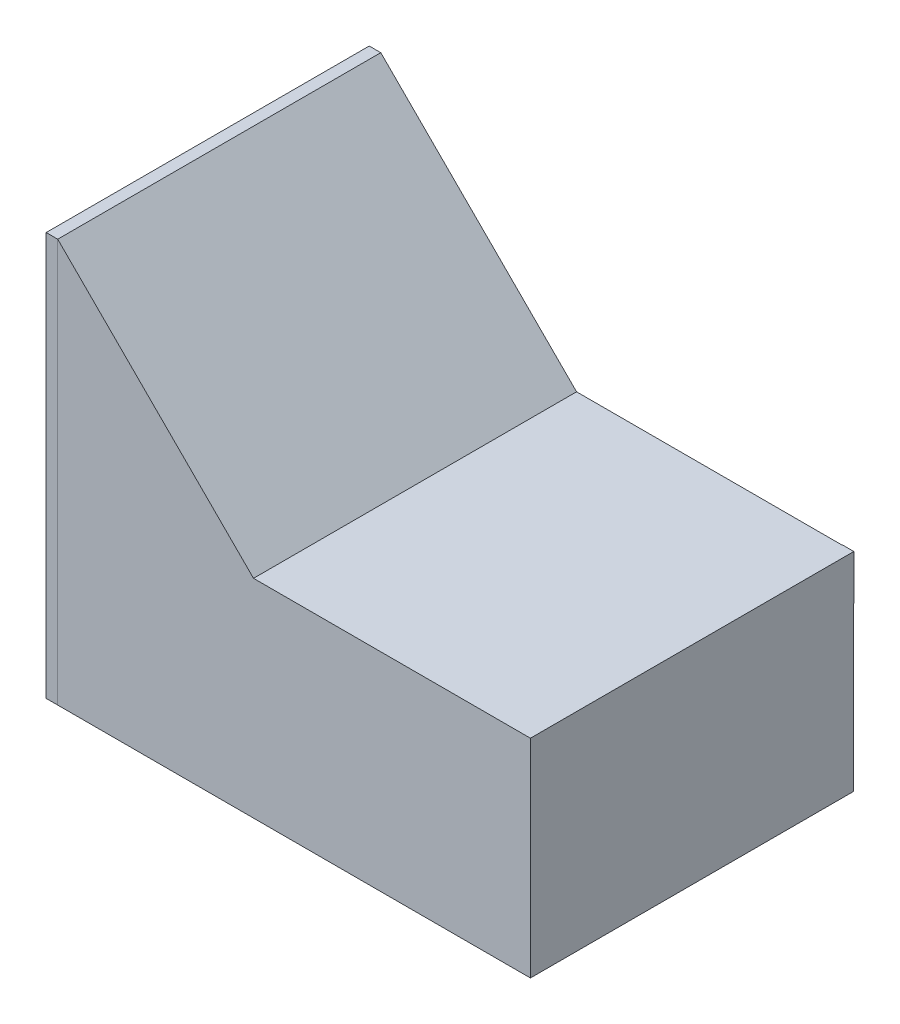
ISO-10303-21;
HEADER;
FILE_DESCRIPTION(('STEP AP214'),'2;1');
FILE_NAME('part.step','',(''),(''),'','','');
FILE_SCHEMA(('AUTOMOTIVE_DESIGN { 1 0 10303 214 1 1 1 1 }'));
ENDSEC;
DATA;
#1=APPLICATION_CONTEXT('core data for automotive mechanical design processes');
#2=APPLICATION_PROTOCOL_DEFINITION('international standard','automotive_design',2000,#1);
#3=PRODUCT_CONTEXT('',#1,'mechanical');
#4=PRODUCT('Part','Part','',(#3));
#5=PRODUCT_RELATED_PRODUCT_CATEGORY('part','',(#4));
#6=PRODUCT_DEFINITION_FORMATION('','',#4);
#7=PRODUCT_DEFINITION_CONTEXT('part definition',#1,'design');
#8=PRODUCT_DEFINITION('design','',#6,#7);
#9=PRODUCT_DEFINITION_SHAPE('','',#8);
#10=(LENGTH_UNIT() NAMED_UNIT(*) SI_UNIT(.MILLI.,.METRE.));
#11=(NAMED_UNIT(*) PLANE_ANGLE_UNIT() SI_UNIT($,.RADIAN.));
#12=(NAMED_UNIT(*) SI_UNIT($,.STERADIAN.) SOLID_ANGLE_UNIT());
#13=UNCERTAINTY_MEASURE_WITH_UNIT(LENGTH_MEASURE(1.E-05),#10,'distance_accuracy_value','');
#14=(GEOMETRIC_REPRESENTATION_CONTEXT(3) GLOBAL_UNCERTAINTY_ASSIGNED_CONTEXT((#13)) GLOBAL_UNIT_ASSIGNED_CONTEXT((#10,
#11,#12)) REPRESENTATION_CONTEXT('',''));
#15=CARTESIAN_POINT('',(0.,0.,0.));
#16=DIRECTION('',(0.,0.,1.));
#17=DIRECTION('',(1.,0.,0.));
#18=AXIS2_PLACEMENT_3D('',#15,#16,#17);
#19=CARTESIAN_POINT('',(-209.852813742386,174.852813742386,0.));
#20=DIRECTION('',(0.,0.,-1.));
#21=DIRECTION('',(-1.,0.,0.));
#22=AXIS2_PLACEMENT_3D('',#19,#20,#21);
#23=PLANE('',#22);
#24=DIRECTION('',(0.,1.,0.));
#25=VECTOR('',#24,1.);
#26=CARTESIAN_POINT('',(-204.852813742386,174.852813742386,0.));
#27=LINE('',#26,#25);
#28=CARTESIAN_POINT('',(-204.852813742386,0.,0.));
#29=VERTEX_POINT('',#28);
#30=CARTESIAN_POINT('',(-204.852813742386,174.852813742386,0.));
#31=VERTEX_POINT('',#30);
#32=EDGE_CURVE('E114',#29,#31,#27,.T.);
#33=ORIENTED_EDGE('',*,*,#32,.T.);
#34=DIRECTION('',(1.,0.,0.));
#35=VECTOR('',#34,1.);
#36=CARTESIAN_POINT('',(-209.852813742386,174.852813742386,0.));
#37=LINE('',#36,#35);
#38=CARTESIAN_POINT('',(-209.852813742386,174.852813742386,0.));
#39=VERTEX_POINT('',#38);
#40=EDGE_CURVE('E12',#39,#31,#37,.T.);
#41=ORIENTED_EDGE('',*,*,#40,.F.);
#42=DIRECTION('',(0.,1.,0.));
#43=VECTOR('',#42,1.);
#44=CARTESIAN_POINT('',(-209.852813742386,174.852813742386,0.));
#45=LINE('',#44,#43);
#46=CARTESIAN_POINT('',(-209.852813742386,0.,0.));
#47=VERTEX_POINT('',#46);
#48=EDGE_CURVE('E102',#47,#39,#45,.T.);
#49=ORIENTED_EDGE('',*,*,#48,.F.);
#50=DIRECTION('',(1.,0.,0.));
#51=VECTOR('',#50,1.);
#52=CARTESIAN_POINT('',(-209.852813742386,0.,0.));
#53=LINE('',#52,#51);
#54=EDGE_CURVE('E110',#47,#29,#53,.T.);
#55=ORIENTED_EDGE('',*,*,#54,.T.);
#56=EDGE_LOOP('',(#33,#41,#49,#55));
#57=FACE_BOUND('',#56,.T.);
#58=ADVANCED_FACE('F51',(#57),#23,.F.);
#59=CARTESIAN_POINT('',(-209.852813742386,174.852813742386,0.));
#60=DIRECTION('',(0.,-1.,0.));
#61=DIRECTION('',(0.,0.,-1.));
#62=AXIS2_PLACEMENT_3D('',#59,#60,#61);
#63=PLANE('',#62);
#64=DIRECTION('',(0.,0.,-1.));
#65=VECTOR('',#64,1.);
#66=CARTESIAN_POINT('',(-204.852813742386,174.852813742386,0.));
#67=LINE('',#66,#65);
#68=CARTESIAN_POINT('',(-204.852813742386,174.852813742386,-140.));
#69=VERTEX_POINT('',#68);
#70=EDGE_CURVE('E106',#31,#69,#67,.T.);
#71=ORIENTED_EDGE('',*,*,#70,.T.);
#72=DIRECTION('',(1.,0.,0.));
#73=VECTOR('',#72,1.);
#74=CARTESIAN_POINT('',(-209.852813742386,174.852813742386,-140.));
#75=LINE('',#74,#73);
#76=CARTESIAN_POINT('',(-209.852813742386,174.852813742386,-140.));
#77=VERTEX_POINT('',#76);
#78=EDGE_CURVE('E59',#77,#69,#75,.T.);
#79=ORIENTED_EDGE('',*,*,#78,.F.);
#80=DIRECTION('',(0.,0.,-1.));
#81=VECTOR('',#80,1.);
#82=CARTESIAN_POINT('',(-209.852813742386,174.852813742386,0.));
#83=LINE('',#82,#81);
#84=EDGE_CURVE('E97',#39,#77,#83,.T.);
#85=ORIENTED_EDGE('',*,*,#84,.F.);
#86=ORIENTED_EDGE('',*,*,#40,.T.);
#87=EDGE_LOOP('',(#71,#79,#85,#86));
#88=FACE_BOUND('',#87,.T.);
#89=ADVANCED_FACE('F105',(#88),#63,.F.);
#90=CARTESIAN_POINT('',(-209.852813742386,174.852813742386,-140.));
#91=DIRECTION('',(0.,0.,1.));
#92=DIRECTION('',(1.,0.,0.));
#93=AXIS2_PLACEMENT_3D('',#90,#91,#92);
#94=PLANE('',#93);
#95=DIRECTION('',(0.,-1.,0.));
#96=VECTOR('',#95,1.);
#97=CARTESIAN_POINT('',(-204.852813742386,174.852813742386,-140.));
#98=LINE('',#97,#96);
#99=CARTESIAN_POINT('',(-204.852813742386,0.,-140.));
#100=VERTEX_POINT('',#99);
#101=EDGE_CURVE('E84',#69,#100,#98,.T.);
#102=ORIENTED_EDGE('',*,*,#101,.T.);
#103=DIRECTION('',(1.,0.,0.));
#104=VECTOR('',#103,1.);
#105=CARTESIAN_POINT('',(-209.852813742386,0.,-140.));
#106=LINE('',#105,#104);
#107=CARTESIAN_POINT('',(-209.852813742386,0.,-140.));
#108=VERTEX_POINT('',#107);
#109=EDGE_CURVE('E107',#108,#100,#106,.T.);
#110=ORIENTED_EDGE('',*,*,#109,.F.);
#111=DIRECTION('',(0.,-1.,0.));
#112=VECTOR('',#111,1.);
#113=CARTESIAN_POINT('',(-209.852813742386,174.852813742386,-140.));
#114=LINE('',#113,#112);
#115=EDGE_CURVE('E100',#77,#108,#114,.T.);
#116=ORIENTED_EDGE('',*,*,#115,.F.);
#117=ORIENTED_EDGE('',*,*,#78,.T.);
#118=EDGE_LOOP('',(#102,#110,#116,#117));
#119=FACE_BOUND('',#118,.T.);
#120=ADVANCED_FACE('F108',(#119),#94,.F.);
#121=CARTESIAN_POINT('',(-209.852813742386,0.,-140.));
#122=DIRECTION('',(0.,1.,0.));
#123=DIRECTION('',(0.,0.,1.));
#124=AXIS2_PLACEMENT_3D('',#121,#122,#123);
#125=PLANE('',#124);
#126=DIRECTION('',(0.,0.,1.));
#127=VECTOR('',#126,1.);
#128=CARTESIAN_POINT('',(-204.852813742386,0.,-140.));
#129=LINE('',#128,#127);
#130=EDGE_CURVE('E90',#100,#29,#129,.T.);
#131=ORIENTED_EDGE('',*,*,#130,.T.);
#132=ORIENTED_EDGE('',*,*,#54,.F.);
#133=DIRECTION('',(0.,0.,1.));
#134=VECTOR('',#133,1.);
#135=CARTESIAN_POINT('',(-209.852813742386,0.,-140.));
#136=LINE('',#135,#134);
#137=EDGE_CURVE('E67',#108,#47,#136,.T.);
#138=ORIENTED_EDGE('',*,*,#137,.F.);
#139=ORIENTED_EDGE('',*,*,#109,.T.);
#140=EDGE_LOOP('',(#131,#132,#138,#139));
#141=FACE_BOUND('',#140,.T.);
#142=ADVANCED_FACE('F121',(#141),#125,.F.);
#143=CARTESIAN_POINT('',(-209.852813742386,0.,0.));
#144=DIRECTION('',(-1.,0.,0.));
#145=DIRECTION('',(0.,0.,1.));
#146=AXIS2_PLACEMENT_3D('',#143,#144,#145);
#147=PLANE('',#146);
#148=ORIENTED_EDGE('',*,*,#48,.T.);
#149=ORIENTED_EDGE('',*,*,#84,.T.);
#150=ORIENTED_EDGE('',*,*,#115,.T.);
#151=ORIENTED_EDGE('',*,*,#137,.T.);
#152=EDGE_LOOP('',(#148,#149,#150,#151));
#153=FACE_BOUND('',#152,.T.);
#154=ADVANCED_FACE('F98',(#153),#147,.T.);
#155=CARTESIAN_POINT('',(-204.852813742386,0.,0.));
#156=DIRECTION('',(-1.,0.,0.));
#157=DIRECTION('',(0.,0.,1.));
#158=AXIS2_PLACEMENT_3D('',#155,#156,#157);
#159=PLANE('',#158);
#160=ORIENTED_EDGE('',*,*,#32,.F.);
#161=ORIENTED_EDGE('',*,*,#130,.F.);
#162=ORIENTED_EDGE('',*,*,#101,.F.);
#163=ORIENTED_EDGE('',*,*,#70,.F.);
#164=EDGE_LOOP('',(#160,#161,#162,#163));
#165=FACE_BOUND('',#164,.T.);
#166=ADVANCED_FACE('F124',(#165),#159,.F.);
#167=CLOSED_SHELL('',(#58,#89,#120,#142,#154,#166));
#168=MANIFOLD_SOLID_BREP('B2',#167);
#169=CARTESIAN_POINT('',(-18.5355339059329,-18.5355339059329,0.));
#170=DIRECTION('',(0.707106781186548,0.707106781186547,0.));
#171=DIRECTION('',(-0.707106781186547,0.707106781186548,0.));
#172=AXIS2_PLACEMENT_3D('',#169,#170,#171);
#173=PLANE('',#172);
#174=DIRECTION('',(0.,0.,-1.));
#175=VECTOR('',#174,1.);
#176=CARTESIAN_POINT('',(-204.852813742386,167.78174593052,0.));
#177=LINE('',#176,#175);
#178=CARTESIAN_POINT('',(-204.852813742386,167.78174593052,-135.));
#179=VERTEX_POINT('',#178);
#180=CARTESIAN_POINT('',(-204.852813742386,167.78174593052,-140.));
#181=VERTEX_POINT('',#180);
#182=EDGE_CURVE('E49',#179,#181,#177,.T.);
#183=ORIENTED_EDGE('',*,*,#182,.F.);
#184=DIRECTION('',(0.707106781186547,-0.707106781186548,0.));
#185=VECTOR('',#184,1.);
#186=CARTESIAN_POINT('',(-18.5355339059329,-18.5355339059328,-135.));
#187=LINE('',#186,#185);
#188=CARTESIAN_POINT('',(-125.,87.9289321881345,-135.));
#189=VERTEX_POINT('',#188);
#190=EDGE_CURVE('E419',#179,#189,#187,.T.);
#191=ORIENTED_EDGE('',*,*,#190,.T.);
#192=DIRECTION('',(0.,0.,-1.));
#193=VECTOR('',#192,1.);
#194=CARTESIAN_POINT('',(-125.,87.9289321881345,0.));
#195=LINE('',#194,#193);
#196=CARTESIAN_POINT('',(-125.,87.9289321881345,-5.));
#197=VERTEX_POINT('',#196);
#198=EDGE_CURVE('E261',#197,#189,#195,.T.);
#199=ORIENTED_EDGE('',*,*,#198,.F.);
#200=DIRECTION('',(-0.707106781186547,0.707106781186548,0.));
#201=VECTOR('',#200,1.);
#202=CARTESIAN_POINT('',(-18.5355339059329,-18.5355339059329,-5.00000000000001));
#203=LINE('',#202,#201);
#204=CARTESIAN_POINT('',(-204.852813742386,167.78174593052,-5.));
#205=VERTEX_POINT('',#204);
#206=EDGE_CURVE('E323',#197,#205,#203,.T.);
#207=ORIENTED_EDGE('',*,*,#206,.T.);
#208=CARTESIAN_POINT('',(-208.388347648318,171.317279836453,-5.));
#209=VERTEX_POINT('',#208);
#210=EDGE_CURVE('E320',#205,#209,#203,.T.);
#211=ORIENTED_EDGE('',*,*,#210,.T.);
#212=DIRECTION('',(0.,0.,-1.));
#213=VECTOR('',#212,1.);
#214=CARTESIAN_POINT('',(-208.388347648318,171.317279836453,0.));
#215=LINE('',#214,#213);
#216=CARTESIAN_POINT('',(-208.388347648318,171.317279836453,-140.));
#217=VERTEX_POINT('',#216);
#218=EDGE_CURVE('E327',#209,#217,#215,.T.);
#219=ORIENTED_EDGE('',*,*,#218,.T.);
#220=DIRECTION('',(0.707106781186547,-0.707106781186548,0.));
#221=VECTOR('',#220,1.);
#222=CARTESIAN_POINT('',(-18.5355339059329,-18.5355339059328,-140.));
#223=LINE('',#222,#221);
#224=EDGE_CURVE('E324',#217,#181,#223,.T.);
#225=ORIENTED_EDGE('',*,*,#224,.T.);
#226=EDGE_LOOP('',(#183,#191,#199,#207,#211,#219,#225));
#227=FACE_BOUND('',#226,.T.);
#228=ADVANCED_FACE('F187',(#227),#173,.F.);
#229=CARTESIAN_POINT('',(-5.,0.,0.));
#230=DIRECTION('',(-1.,0.,0.));
#231=DIRECTION('',(0.,-1.,0.));
#232=AXIS2_PLACEMENT_3D('',#229,#230,#231);
#233=PLANE('',#232);
#234=DIRECTION('',(0.,0.999998636393386,-0.00165142707042378));
#235=VECTOR('',#234,1.);
#236=CARTESIAN_POINT('',(-5.,90.,-140.148628639009));
#237=LINE('',#236,#235);
#238=CARTESIAN_POINT('',(-5.,0.,-140.));
#239=VERTEX_POINT('',#238);
#240=CARTESIAN_POINT('',(-5.,90.,-140.148628639009));
#241=VERTEX_POINT('',#240);
#242=EDGE_CURVE('E436',#239,#241,#237,.T.);
#243=ORIENTED_EDGE('',*,*,#242,.F.);
#244=DIRECTION('',(0.,1.,0.));
#245=VECTOR('',#244,1.);
#246=CARTESIAN_POINT('',(-5.,85.,-140.));
#247=LINE('',#246,#245);
#248=CARTESIAN_POINT('',(-5.,90.,-140.));
#249=VERTEX_POINT('',#248);
#250=EDGE_CURVE('E310',#239,#249,#247,.T.);
#251=ORIENTED_EDGE('',*,*,#250,.T.);
#252=DIRECTION('',(0.,0.,1.));
#253=VECTOR('',#252,1.);
#254=CARTESIAN_POINT('',(-5.,90.,0.));
#255=LINE('',#254,#253);
#256=EDGE_CURVE('E384',#241,#249,#255,.T.);
#257=ORIENTED_EDGE('',*,*,#256,.F.);
#258=EDGE_LOOP('',(#243,#251,#257));
#259=FACE_BOUND('',#258,.T.);
#260=ADVANCED_FACE('F449',(#259),#233,.T.);
#261=CARTESIAN_POINT('',(0.,0.,-5.));
#262=DIRECTION('',(0.,0.,-1.));
#263=DIRECTION('',(-1.,0.,0.));
#264=AXIS2_PLACEMENT_3D('',#261,#262,#263);
#265=PLANE('',#264);
#266=DIRECTION('',(0.,1.,0.));
#267=VECTOR('',#266,1.);
#268=CARTESIAN_POINT('',(-5.,0.,-5.));
#269=LINE('',#268,#267);
#270=CARTESIAN_POINT('',(-5.,0.,-5.));
#271=VERTEX_POINT('',#270);
#272=CARTESIAN_POINT('',(-5.,85.,-5.));
#273=VERTEX_POINT('',#272);
#274=EDGE_CURVE('E303',#271,#273,#269,.T.);
#275=ORIENTED_EDGE('',*,*,#274,.F.);
#276=DIRECTION('',(1.,0.,0.));
#277=VECTOR('',#276,1.);
#278=CARTESIAN_POINT('',(0.,0.,-5.));
#279=LINE('',#278,#277);
#280=CARTESIAN_POINT('',(-204.852813742386,0.,-5.));
#281=VERTEX_POINT('',#280);
#282=EDGE_CURVE('E268',#281,#271,#279,.T.);
#283=ORIENTED_EDGE('',*,*,#282,.F.);
#284=DIRECTION('',(0.,-1.,0.));
#285=VECTOR('',#284,1.);
#286=CARTESIAN_POINT('',(-204.852813742386,0.,-5.));
#287=LINE('',#286,#285);
#288=EDGE_CURVE('E211',#205,#281,#287,.T.);
#289=ORIENTED_EDGE('',*,*,#288,.F.);
#290=ORIENTED_EDGE('',*,*,#206,.F.);
#291=DIRECTION('',(0.,1.,0.));
#292=VECTOR('',#291,1.);
#293=CARTESIAN_POINT('',(-125.,85.,-5.));
#294=LINE('',#293,#292);
#295=CARTESIAN_POINT('',(-125.,85.,-5.));
#296=VERTEX_POINT('',#295);
#297=EDGE_CURVE('E339',#296,#197,#294,.T.);
#298=ORIENTED_EDGE('',*,*,#297,.F.);
#299=DIRECTION('',(-1.,0.,0.));
#300=VECTOR('',#299,1.);
#301=CARTESIAN_POINT('',(0.,85.,-5.));
#302=LINE('',#301,#300);
#303=EDGE_CURVE('E344',#273,#296,#302,.T.);
#304=ORIENTED_EDGE('',*,*,#303,.F.);
#305=EDGE_LOOP('',(#275,#283,#289,#290,#298,#304));
#306=FACE_BOUND('',#305,.T.);
#307=ADVANCED_FACE('F451',(#306),#265,.T.);
#308=CARTESIAN_POINT('',(-125.,0.,0.));
#309=DIRECTION('',(-1.,0.,0.));
#310=DIRECTION('',(0.,0.,1.));
#311=AXIS2_PLACEMENT_3D('',#308,#309,#310);
#312=PLANE('',#311);
#313=DIRECTION('',(0.,1.,0.));
#314=VECTOR('',#313,1.);
#315=CARTESIAN_POINT('',(-125.,0.,-135.));
#316=LINE('',#315,#314);
#317=CARTESIAN_POINT('',(-125.,85.,-135.));
#318=VERTEX_POINT('',#317);
#319=EDGE_CURVE('E297',#318,#189,#316,.T.);
#320=ORIENTED_EDGE('',*,*,#319,.F.);
#321=DIRECTION('',(0.,0.,1.));
#322=VECTOR('',#321,1.);
#323=CARTESIAN_POINT('',(-125.,85.,-140.));
#324=LINE('',#323,#322);
#325=EDGE_CURVE('E202',#318,#296,#324,.T.);
#326=ORIENTED_EDGE('',*,*,#325,.T.);
#327=ORIENTED_EDGE('',*,*,#297,.T.);
#328=ORIENTED_EDGE('',*,*,#198,.T.);
#329=EDGE_LOOP('',(#320,#326,#327,#328));
#330=FACE_BOUND('',#329,.T.);
#331=ADVANCED_FACE('F457',(#330),#312,.T.);
#332=CARTESIAN_POINT('',(0.,90.,-5.));
#333=DIRECTION('',(1.,0.,0.));
#334=DIRECTION('',(0.,1.,0.));
#335=AXIS2_PLACEMENT_3D('',#332,#333,#334);
#336=PLANE('',#335);
#337=DIRECTION('',(0.,1.,0.));
#338=VECTOR('',#337,1.);
#339=CARTESIAN_POINT('',(0.,90.,0.));
#340=LINE('',#339,#338);
#341=CARTESIAN_POINT('',(0.,0.,0.));
#342=VERTEX_POINT('',#341);
#343=CARTESIAN_POINT('',(0.,90.,0.));
#344=VERTEX_POINT('',#343);
#345=EDGE_CURVE('E345',#342,#344,#340,.T.);
#346=ORIENTED_EDGE('',*,*,#345,.F.);
#347=DIRECTION('',(0.,0.,1.));
#348=VECTOR('',#347,1.);
#349=CARTESIAN_POINT('',(0.,0.,-5.));
#350=LINE('',#349,#348);
#351=CARTESIAN_POINT('',(0.,0.,-140.));
#352=VERTEX_POINT('',#351);
#353=EDGE_CURVE('E239',#352,#342,#350,.T.);
#354=ORIENTED_EDGE('',*,*,#353,.F.);
#355=DIRECTION('',(0.,0.999998636393386,-0.00165142707042378));
#356=VECTOR('',#355,1.);
#357=CARTESIAN_POINT('',(0.,90.,-140.148628639009));
#358=LINE('',#357,#356);
#359=CARTESIAN_POINT('',(0.,90.,-140.148628639009));
#360=VERTEX_POINT('',#359);
#361=EDGE_CURVE('E434',#352,#360,#358,.T.);
#362=ORIENTED_EDGE('',*,*,#361,.T.);
#363=DIRECTION('',(0.,0.,1.));
#364=VECTOR('',#363,1.);
#365=CARTESIAN_POINT('',(0.,90.,-5.));
#366=LINE('',#365,#364);
#367=EDGE_CURVE('E266',#360,#344,#366,.T.);
#368=ORIENTED_EDGE('',*,*,#367,.T.);
#369=EDGE_LOOP('',(#346,#354,#362,#368));
#370=FACE_BOUND('',#369,.T.);
#371=ADVANCED_FACE('F189',(#370),#336,.T.);
#372=CARTESIAN_POINT('',(0.,0.,-5.));
#373=DIRECTION('',(0.,-1.,0.));
#374=DIRECTION('',(1.,0.,0.));
#375=AXIS2_PLACEMENT_3D('',#372,#373,#374);
#376=PLANE('',#375);
#377=DIRECTION('',(0.,0.,-1.));
#378=VECTOR('',#377,1.);
#379=CARTESIAN_POINT('',(-5.,0.,-140.));
#380=LINE('',#379,#378);
#381=CARTESIAN_POINT('',(-5.,0.,-135.));
#382=VERTEX_POINT('',#381);
#383=EDGE_CURVE('E305',#271,#382,#380,.T.);
#384=ORIENTED_EDGE('',*,*,#383,.T.);
#385=DIRECTION('',(1.,0.,0.));
#386=VECTOR('',#385,1.);
#387=CARTESIAN_POINT('',(0.,0.,-135.));
#388=LINE('',#387,#386);
#389=CARTESIAN_POINT('',(-204.852813742386,0.,-135.));
#390=VERTEX_POINT('',#389);
#391=EDGE_CURVE('E288',#390,#382,#388,.T.);
#392=ORIENTED_EDGE('',*,*,#391,.F.);
#393=DIRECTION('',(0.,0.,-1.));
#394=VECTOR('',#393,1.);
#395=CARTESIAN_POINT('',(-204.852813742386,0.,-135.));
#396=LINE('',#395,#394);
#397=CARTESIAN_POINT('',(-204.852813742386,0.,-140.));
#398=VERTEX_POINT('',#397);
#399=EDGE_CURVE('E298',#390,#398,#396,.T.);
#400=ORIENTED_EDGE('',*,*,#399,.T.);
#401=DIRECTION('',(1.,0.,0.));
#402=VECTOR('',#401,1.);
#403=CARTESIAN_POINT('',(0.,0.,-140.));
#404=LINE('',#403,#402);
#405=EDGE_CURVE('E428',#398,#239,#404,.T.);
#406=ORIENTED_EDGE('',*,*,#405,.T.);
#407=DIRECTION('',(1.,0.,0.));
#408=VECTOR('',#407,1.);
#409=CARTESIAN_POINT('',(-5.,0.,-140.));
#410=LINE('',#409,#408);
#411=EDGE_CURVE('E440',#239,#352,#410,.T.);
#412=ORIENTED_EDGE('',*,*,#411,.T.);
#413=ORIENTED_EDGE('',*,*,#353,.T.);
#414=DIRECTION('',(1.,0.,0.));
#415=VECTOR('',#414,1.);
#416=CARTESIAN_POINT('',(0.,0.,0.));
#417=LINE('',#416,#415);
#418=CARTESIAN_POINT('',(-204.852813742386,0.,0.));
#419=VERTEX_POINT('',#418);
#420=EDGE_CURVE('E246',#419,#342,#417,.T.);
#421=ORIENTED_EDGE('',*,*,#420,.F.);
#422=DIRECTION('',(0.,0.,1.));
#423=VECTOR('',#422,1.);
#424=CARTESIAN_POINT('',(-204.852813742386,0.,-5.));
#425=LINE('',#424,#423);
#426=EDGE_CURVE('E229',#281,#419,#425,.T.);
#427=ORIENTED_EDGE('',*,*,#426,.F.);
#428=ORIENTED_EDGE('',*,*,#282,.T.);
#429=EDGE_LOOP('',(#384,#392,#400,#406,#412,#413,#421,#427,#428));
#430=FACE_BOUND('',#429,.T.);
#431=ADVANCED_FACE('F253',(#430),#376,.T.);
#432=CARTESIAN_POINT('',(-204.852813742386,0.,-5.));
#433=DIRECTION('',(-1.,0.,0.));
#434=DIRECTION('',(0.,-1.,0.));
#435=AXIS2_PLACEMENT_3D('',#432,#433,#434);
#436=PLANE('',#435);
#437=DIRECTION('',(0.,-1.,0.));
#438=VECTOR('',#437,1.);
#439=CARTESIAN_POINT('',(-204.852813742386,0.,0.));
#440=LINE('',#439,#438);
#441=CARTESIAN_POINT('',(-204.852813742386,174.852813742386,0.));
#442=VERTEX_POINT('',#441);
#443=EDGE_CURVE('E233',#442,#419,#440,.T.);
#444=ORIENTED_EDGE('',*,*,#443,.F.);
#445=DIRECTION('',(0.,0.,1.));
#446=VECTOR('',#445,1.);
#447=CARTESIAN_POINT('',(-204.852813742386,174.852813742386,-5.));
#448=LINE('',#447,#446);
#449=CARTESIAN_POINT('',(-204.852813742386,174.852813742386,-5.));
#450=VERTEX_POINT('',#449);
#451=EDGE_CURVE('E240',#450,#442,#448,.T.);
#452=ORIENTED_EDGE('',*,*,#451,.F.);
#453=EDGE_CURVE('E257',#450,#205,#287,.T.);
#454=ORIENTED_EDGE('',*,*,#453,.T.);
#455=ORIENTED_EDGE('',*,*,#288,.T.);
#456=ORIENTED_EDGE('',*,*,#426,.T.);
#457=EDGE_LOOP('',(#444,#452,#454,#455,#456));
#458=FACE_BOUND('',#457,.T.);
#459=ADVANCED_FACE('F231',(#458),#436,.T.);
#460=CARTESIAN_POINT('',(-204.852813742386,174.852813742386,-5.));
#461=DIRECTION('',(0.707106781186548,0.707106781186547,0.));
#462=DIRECTION('',(-0.707106781186547,0.707106781186548,0.));
#463=AXIS2_PLACEMENT_3D('',#460,#461,#462);
#464=PLANE('',#463);
#465=DIRECTION('',(-0.707106781186547,0.707106781186548,0.));
#466=VECTOR('',#465,1.);
#467=CARTESIAN_POINT('',(-204.852813742386,174.852813742386,0.));
#468=LINE('',#467,#466);
#469=CARTESIAN_POINT('',(-120.,90.,0.));
#470=VERTEX_POINT('',#469);
#471=EDGE_CURVE('E250',#470,#442,#468,.T.);
#472=ORIENTED_EDGE('',*,*,#471,.F.);
#473=DIRECTION('',(0.,0.,1.));
#474=VECTOR('',#473,1.);
#475=CARTESIAN_POINT('',(-120.,90.,-5.));
#476=LINE('',#475,#474);
#477=CARTESIAN_POINT('',(-120.,90.,-140.));
#478=VERTEX_POINT('',#477);
#479=EDGE_CURVE('E264',#478,#470,#476,.T.);
#480=ORIENTED_EDGE('',*,*,#479,.F.);
#481=DIRECTION('',(0.707106781186547,-0.707106781186548,0.));
#482=VECTOR('',#481,1.);
#483=CARTESIAN_POINT('',(-15.0000000000002,-15.0000000000001,-140.));
#484=LINE('',#483,#482);
#485=CARTESIAN_POINT('',(-204.852813742386,174.852813742386,-140.));
#486=VERTEX_POINT('',#485);
#487=EDGE_CURVE('E309',#486,#478,#484,.T.);
#488=ORIENTED_EDGE('',*,*,#487,.F.);
#489=DIRECTION('',(0.,0.,-1.));
#490=VECTOR('',#489,1.);
#491=CARTESIAN_POINT('',(-204.852813742386,174.852813742386,0.));
#492=LINE('',#491,#490);
#493=EDGE_CURVE('E313',#450,#486,#492,.T.);
#494=ORIENTED_EDGE('',*,*,#493,.F.);
#495=ORIENTED_EDGE('',*,*,#451,.T.);
#496=EDGE_LOOP('',(#472,#480,#488,#494,#495));
#497=FACE_BOUND('',#496,.T.);
#498=ADVANCED_FACE('F355',(#497),#464,.T.);
#499=CARTESIAN_POINT('',(-120.,90.,-5.));
#500=DIRECTION('',(0.,1.,0.));
#501=DIRECTION('',(0.,0.,1.));
#502=AXIS2_PLACEMENT_3D('',#499,#500,#501);
#503=PLANE('',#502);
#504=DIRECTION('',(-1.,0.,0.));
#505=VECTOR('',#504,1.);
#506=CARTESIAN_POINT('',(-120.,90.,0.));
#507=LINE('',#506,#505);
#508=EDGE_CURVE('E349',#344,#470,#507,.T.);
#509=ORIENTED_EDGE('',*,*,#508,.F.);
#510=ORIENTED_EDGE('',*,*,#367,.F.);
#511=DIRECTION('',(1.,0.,0.));
#512=VECTOR('',#511,1.);
#513=CARTESIAN_POINT('',(-5.,90.,-140.148628639009));
#514=LINE('',#513,#512);
#515=EDGE_CURVE('E316',#241,#360,#514,.T.);
#516=ORIENTED_EDGE('',*,*,#515,.F.);
#517=ORIENTED_EDGE('',*,*,#256,.T.);
#518=DIRECTION('',(-1.,0.,0.));
#519=VECTOR('',#518,1.);
#520=CARTESIAN_POINT('',(-120.,90.,-140.));
#521=LINE('',#520,#519);
#522=EDGE_CURVE('E341',#249,#478,#521,.T.);
#523=ORIENTED_EDGE('',*,*,#522,.T.);
#524=ORIENTED_EDGE('',*,*,#479,.T.);
#525=EDGE_LOOP('',(#509,#510,#516,#517,#523,#524));
#526=FACE_BOUND('',#525,.T.);
#527=ADVANCED_FACE('F380',(#526),#503,.T.);
#528=CARTESIAN_POINT('',(0.,0.,0.));
#529=DIRECTION('',(0.,0.,-1.));
#530=DIRECTION('',(-1.,0.,0.));
#531=AXIS2_PLACEMENT_3D('',#528,#529,#530);
#532=PLANE('',#531);
#533=ORIENTED_EDGE('',*,*,#420,.T.);
#534=ORIENTED_EDGE('',*,*,#345,.T.);
#535=ORIENTED_EDGE('',*,*,#508,.T.);
#536=ORIENTED_EDGE('',*,*,#471,.T.);
#537=ORIENTED_EDGE('',*,*,#443,.T.);
#538=EDGE_LOOP('',(#533,#534,#535,#536,#537));
#539=FACE_BOUND('',#538,.T.);
#540=ADVANCED_FACE('F244',(#539),#532,.F.);
#541=CARTESIAN_POINT('',(-120.,85.,-140.));
#542=DIRECTION('',(0.,0.,-1.));
#543=DIRECTION('',(-1.,0.,0.));
#544=AXIS2_PLACEMENT_3D('',#541,#542,#543);
#545=PLANE('',#544);
#546=DIRECTION('',(0.,-1.,0.));
#547=VECTOR('',#546,1.);
#548=CARTESIAN_POINT('',(-204.852813742386,0.,-140.));
#549=LINE('',#548,#547);
#550=EDGE_CURVE('E425',#181,#398,#549,.T.);
#551=ORIENTED_EDGE('',*,*,#550,.F.);
#552=ORIENTED_EDGE('',*,*,#224,.F.);
#553=DIRECTION('',(0.707106781186548,0.707106781186547,0.));
#554=VECTOR('',#553,1.);
#555=CARTESIAN_POINT('',(-208.388347648318,171.317279836453,-140.));
#556=LINE('',#555,#554);
#557=EDGE_CURVE('E329',#217,#486,#556,.T.);
#558=ORIENTED_EDGE('',*,*,#557,.T.);
#559=ORIENTED_EDGE('',*,*,#487,.T.);
#560=ORIENTED_EDGE('',*,*,#522,.F.);
#561=ORIENTED_EDGE('',*,*,#250,.F.);
#562=ORIENTED_EDGE('',*,*,#405,.F.);
#563=EDGE_LOOP('',(#551,#552,#558,#559,#560,#561,#562));
#564=FACE_BOUND('',#563,.T.);
#565=ADVANCED_FACE('F388',(#564),#545,.T.);
#566=CARTESIAN_POINT('',(0.,85.,0.));
#567=DIRECTION('',(0.,-1.,0.));
#568=DIRECTION('',(0.,0.,-1.));
#569=AXIS2_PLACEMENT_3D('',#566,#567,#568);
#570=PLANE('',#569);
#571=DIRECTION('',(-1.,0.,0.));
#572=VECTOR('',#571,1.);
#573=CARTESIAN_POINT('',(0.,85.,-135.));
#574=LINE('',#573,#572);
#575=CARTESIAN_POINT('',(-5.,85.,-135.));
#576=VERTEX_POINT('',#575);
#577=EDGE_CURVE('E284',#576,#318,#574,.T.);
#578=ORIENTED_EDGE('',*,*,#577,.F.);
#579=DIRECTION('',(0.,0.,-1.));
#580=VECTOR('',#579,1.);
#581=CARTESIAN_POINT('',(-5.,85.,0.));
#582=LINE('',#581,#580);
#583=EDGE_CURVE('E271',#273,#576,#582,.T.);
#584=ORIENTED_EDGE('',*,*,#583,.F.);
#585=ORIENTED_EDGE('',*,*,#303,.T.);
#586=ORIENTED_EDGE('',*,*,#325,.F.);
#587=EDGE_LOOP('',(#578,#584,#585,#586));
#588=FACE_BOUND('',#587,.T.);
#589=ADVANCED_FACE('F294',(#588),#570,.T.);
#590=CARTESIAN_POINT('',(-18.5355339059329,-18.5355339059329,-5.00000000000001));
#591=DIRECTION('',(0.,0.,-1.));
#592=DIRECTION('',(0.,1.,0.));
#593=AXIS2_PLACEMENT_3D('',#590,#591,#592);
#594=PLANE('',#593);
#595=ORIENTED_EDGE('',*,*,#453,.F.);
#596=DIRECTION('',(0.707106781186548,0.707106781186547,0.));
#597=VECTOR('',#596,1.);
#598=CARTESIAN_POINT('',(-208.388347648318,171.317279836453,-5.));
#599=LINE('',#598,#597);
#600=EDGE_CURVE('E333',#209,#450,#599,.T.);
#601=ORIENTED_EDGE('',*,*,#600,.F.);
#602=ORIENTED_EDGE('',*,*,#210,.F.);
#603=EDGE_LOOP('',(#595,#601,#602));
#604=FACE_BOUND('',#603,.T.);
#605=ADVANCED_FACE('F471',(#604),#594,.F.);
#606=CARTESIAN_POINT('',(-208.388347648318,171.317279836453,0.));
#607=DIRECTION('',(0.707106781186547,-0.707106781186548,0.));
#608=DIRECTION('',(0.707106781186548,0.707106781186547,0.));
#609=AXIS2_PLACEMENT_3D('',#606,#607,#608);
#610=PLANE('',#609);
#611=ORIENTED_EDGE('',*,*,#493,.T.);
#612=ORIENTED_EDGE('',*,*,#557,.F.);
#613=ORIENTED_EDGE('',*,*,#218,.F.);
#614=ORIENTED_EDGE('',*,*,#600,.T.);
#615=EDGE_LOOP('',(#611,#612,#613,#614));
#616=FACE_BOUND('',#615,.T.);
#617=ADVANCED_FACE('F467',(#616),#610,.F.);
#618=CARTESIAN_POINT('',(-5.,90.,-140.148628639009));
#619=DIRECTION('',(0.,-0.00165142707042378,-0.999998636393386));
#620=DIRECTION('',(0.,0.999998636393386,-0.00165142707042378));
#621=AXIS2_PLACEMENT_3D('',#618,#619,#620);
#622=PLANE('',#621);
#623=ORIENTED_EDGE('',*,*,#361,.F.);
#624=ORIENTED_EDGE('',*,*,#411,.F.);
#625=ORIENTED_EDGE('',*,*,#242,.T.);
#626=ORIENTED_EDGE('',*,*,#515,.T.);
#627=EDGE_LOOP('',(#623,#624,#625,#626));
#628=FACE_BOUND('',#627,.T.);
#629=ADVANCED_FACE('F447',(#628),#622,.T.);
#630=DIRECTION('',(0.,1.,0.));
#631=VECTOR('',#630,1.);
#632=CARTESIAN_POINT('',(-5.,0.,-135.));
#633=LINE('',#632,#631);
#634=EDGE_CURVE('E195',#382,#576,#633,.T.);
#635=ORIENTED_EDGE('',*,*,#634,.F.);
#636=ORIENTED_EDGE('',*,*,#383,.F.);
#637=ORIENTED_EDGE('',*,*,#274,.T.);
#638=ORIENTED_EDGE('',*,*,#583,.T.);
#639=EDGE_LOOP('',(#635,#636,#637,#638));
#640=FACE_BOUND('',#639,.T.);
#641=ADVANCED_FACE('F301',(#640),#233,.T.);
#642=CARTESIAN_POINT('',(-204.852813742386,0.,-135.));
#643=DIRECTION('',(1.,0.,0.));
#644=DIRECTION('',(0.,1.,0.));
#645=AXIS2_PLACEMENT_3D('',#642,#643,#644);
#646=PLANE('',#645);
#647=DIRECTION('',(0.,-1.,0.));
#648=VECTOR('',#647,1.);
#649=CARTESIAN_POINT('',(-204.852813742386,0.,-135.));
#650=LINE('',#649,#648);
#651=EDGE_CURVE('E417',#179,#390,#650,.T.);
#652=ORIENTED_EDGE('',*,*,#651,.F.);
#653=ORIENTED_EDGE('',*,*,#182,.T.);
#654=ORIENTED_EDGE('',*,*,#550,.T.);
#655=ORIENTED_EDGE('',*,*,#399,.F.);
#656=EDGE_LOOP('',(#652,#653,#654,#655));
#657=FACE_BOUND('',#656,.T.);
#658=ADVANCED_FACE('F424',(#657),#646,.F.);
#659=CARTESIAN_POINT('',(0.,0.,-135.));
#660=DIRECTION('',(0.,0.,1.));
#661=DIRECTION('',(-1.,0.,0.));
#662=AXIS2_PLACEMENT_3D('',#659,#660,#661);
#663=PLANE('',#662);
#664=ORIENTED_EDGE('',*,*,#190,.F.);
#665=ORIENTED_EDGE('',*,*,#651,.T.);
#666=ORIENTED_EDGE('',*,*,#391,.T.);
#667=ORIENTED_EDGE('',*,*,#634,.T.);
#668=ORIENTED_EDGE('',*,*,#577,.T.);
#669=ORIENTED_EDGE('',*,*,#319,.T.);
#670=EDGE_LOOP('',(#664,#665,#666,#667,#668,#669));
#671=FACE_BOUND('',#670,.T.);
#672=ADVANCED_FACE('F281',(#671),#663,.T.);
#673=CLOSED_SHELL('',(#228,#260,#307,#331,#371,#431,#459,#498,#527,#540,#565,#589,#605,#617,
#629,#641,#658,#672));
#674=MANIFOLD_SOLID_BREP('B6',#673);
#675=ADVANCED_BREP_SHAPE_REPRESENTATION('',(#18,#168,#674),#14);
#676=SHAPE_DEFINITION_REPRESENTATION(#9,#675);
ENDSEC;
END-ISO-10303-21;
